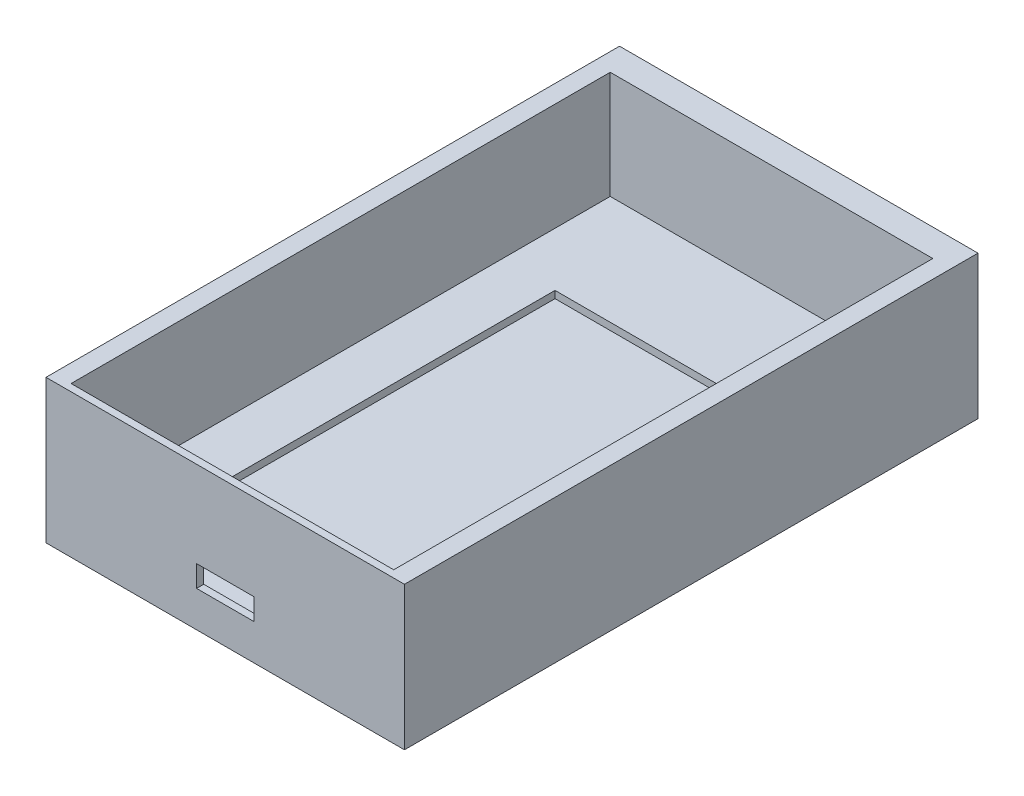
ISO-10303-21;
HEADER;
FILE_DESCRIPTION(('STEP AP214'),'2;1');
FILE_NAME('part.step','',(''),(''),'','','');
FILE_SCHEMA(('AUTOMOTIVE_DESIGN { 1 0 10303 214 1 1 1 1 }'));
ENDSEC;
DATA;
#1=APPLICATION_CONTEXT('core data for automotive mechanical design processes');
#2=APPLICATION_PROTOCOL_DEFINITION('international standard','automotive_design',2000,#1);
#3=PRODUCT_CONTEXT('',#1,'mechanical');
#4=PRODUCT('Part','Part','',(#3));
#5=PRODUCT_RELATED_PRODUCT_CATEGORY('part','',(#4));
#6=PRODUCT_DEFINITION_FORMATION('','',#4);
#7=PRODUCT_DEFINITION_CONTEXT('part definition',#1,'design');
#8=PRODUCT_DEFINITION('design','',#6,#7);
#9=PRODUCT_DEFINITION_SHAPE('','',#8);
#10=(LENGTH_UNIT() NAMED_UNIT(*) SI_UNIT(.MILLI.,.METRE.));
#11=(NAMED_UNIT(*) PLANE_ANGLE_UNIT() SI_UNIT($,.RADIAN.));
#12=(NAMED_UNIT(*) SI_UNIT($,.STERADIAN.) SOLID_ANGLE_UNIT());
#13=UNCERTAINTY_MEASURE_WITH_UNIT(LENGTH_MEASURE(1.E-05),#10,'distance_accuracy_value','');
#14=(GEOMETRIC_REPRESENTATION_CONTEXT(3) GLOBAL_UNCERTAINTY_ASSIGNED_CONTEXT((#13)) GLOBAL_UNIT_ASSIGNED_CONTEXT((#10,
#11,#12)) REPRESENTATION_CONTEXT('',''));
#15=CARTESIAN_POINT('',(0.,0.,0.));
#16=DIRECTION('',(0.,0.,1.));
#17=DIRECTION('',(1.,0.,0.));
#18=AXIS2_PLACEMENT_3D('',#15,#16,#17);
#19=CARTESIAN_POINT('',(0.,-5.,0.));
#20=DIRECTION('',(0.,1.,0.));
#21=DIRECTION('',(-1.,0.,0.));
#22=AXIS2_PLACEMENT_3D('',#19,#20,#21);
#23=PLANE('',#22);
#24=DIRECTION('',(0.,0.,1.));
#25=VECTOR('',#24,1.);
#26=CARTESIAN_POINT('',(-15.,-5.,39.));
#27=LINE('',#26,#25);
#28=CARTESIAN_POINT('',(-15.,-5.,-21.));
#29=VERTEX_POINT('',#28);
#30=CARTESIAN_POINT('',(-15.,-5.,39.));
#31=VERTEX_POINT('',#30);
#32=EDGE_CURVE('E151',#29,#31,#27,.T.);
#33=ORIENTED_EDGE('',*,*,#32,.F.);
#34=DIRECTION('',(-1.,0.,0.));
#35=VECTOR('',#34,1.);
#36=CARTESIAN_POINT('',(15.,-5.,-21.));
#37=LINE('',#36,#35);
#38=CARTESIAN_POINT('',(15.,-5.,-21.));
#39=VERTEX_POINT('',#38);
#40=EDGE_CURVE('E169',#39,#29,#37,.T.);
#41=ORIENTED_EDGE('',*,*,#40,.F.);
#42=DIRECTION('',(0.,0.,-1.));
#43=VECTOR('',#42,1.);
#44=CARTESIAN_POINT('',(15.,-5.,39.));
#45=LINE('',#44,#43);
#46=CARTESIAN_POINT('',(15.,-5.,39.));
#47=VERTEX_POINT('',#46);
#48=EDGE_CURVE('E172',#47,#39,#45,.T.);
#49=ORIENTED_EDGE('',*,*,#48,.F.);
#50=DIRECTION('',(1.,0.,0.));
#51=VECTOR('',#50,1.);
#52=CARTESIAN_POINT('',(22.5,-5.,39.));
#53=LINE('',#52,#51);
#54=CARTESIAN_POINT('',(22.5,-5.,39.));
#55=VERTEX_POINT('',#54);
#56=EDGE_CURVE('E215',#47,#55,#53,.T.);
#57=ORIENTED_EDGE('',*,*,#56,.T.);
#58=DIRECTION('',(0.,0.,-1.));
#59=VECTOR('',#58,1.);
#60=CARTESIAN_POINT('',(22.5,-5.,39.));
#61=LINE('',#60,#59);
#62=CARTESIAN_POINT('',(22.5,-5.,-36.2));
#63=VERTEX_POINT('',#62);
#64=EDGE_CURVE('E219',#55,#63,#61,.T.);
#65=ORIENTED_EDGE('',*,*,#64,.T.);
#66=DIRECTION('',(-1.,0.,0.));
#67=VECTOR('',#66,1.);
#68=CARTESIAN_POINT('',(22.5,-5.,-36.2));
#69=LINE('',#68,#67);
#70=CARTESIAN_POINT('',(-22.5,-5.,-36.2));
#71=VERTEX_POINT('',#70);
#72=EDGE_CURVE('E222',#63,#71,#69,.T.);
#73=ORIENTED_EDGE('',*,*,#72,.T.);
#74=DIRECTION('',(0.,0.,1.));
#75=VECTOR('',#74,1.);
#76=CARTESIAN_POINT('',(-22.5,-5.,39.));
#77=LINE('',#76,#75);
#78=CARTESIAN_POINT('',(-22.5,-5.,39.));
#79=VERTEX_POINT('',#78);
#80=EDGE_CURVE('E212',#71,#79,#77,.T.);
#81=ORIENTED_EDGE('',*,*,#80,.T.);
#82=EDGE_CURVE('E217',#79,#31,#53,.T.);
#83=ORIENTED_EDGE('',*,*,#82,.T.);
#84=EDGE_LOOP('',(#33,#41,#49,#57,#65,#73,#81,#83));
#85=FACE_BOUND('',#84,.T.);
#86=ADVANCED_FACE('F32',(#85),#23,.T.);
#87=CARTESIAN_POINT('',(-25.,-10.,40.));
#88=DIRECTION('',(1.,0.,0.));
#89=DIRECTION('',(0.,0.,-1.));
#90=AXIS2_PLACEMENT_3D('',#87,#88,#89);
#91=PLANE('',#90);
#92=DIRECTION('',(0.,-1.,0.));
#93=VECTOR('',#92,1.);
#94=CARTESIAN_POINT('',(-25.,-10.,-40.));
#95=LINE('',#94,#93);
#96=CARTESIAN_POINT('',(-25.,10.,-40.));
#97=VERTEX_POINT('',#96);
#98=CARTESIAN_POINT('',(-25.,-10.,-40.));
#99=VERTEX_POINT('',#98);
#100=EDGE_CURVE('E237',#97,#99,#95,.T.);
#101=ORIENTED_EDGE('',*,*,#100,.T.);
#102=DIRECTION('',(0.,0.,-1.));
#103=VECTOR('',#102,1.);
#104=CARTESIAN_POINT('',(-25.,-10.,40.));
#105=LINE('',#104,#103);
#106=CARTESIAN_POINT('',(-25.,-10.,40.));
#107=VERTEX_POINT('',#106);
#108=EDGE_CURVE('E40',#107,#99,#105,.T.);
#109=ORIENTED_EDGE('',*,*,#108,.F.);
#110=DIRECTION('',(0.,-1.,0.));
#111=VECTOR('',#110,1.);
#112=CARTESIAN_POINT('',(-25.,-10.,40.));
#113=LINE('',#112,#111);
#114=CARTESIAN_POINT('',(-25.,10.,40.));
#115=VERTEX_POINT('',#114);
#116=EDGE_CURVE('E244',#115,#107,#113,.T.);
#117=ORIENTED_EDGE('',*,*,#116,.F.);
#118=DIRECTION('',(0.,0.,-1.));
#119=VECTOR('',#118,1.);
#120=CARTESIAN_POINT('',(-25.,10.,40.));
#121=LINE('',#120,#119);
#122=EDGE_CURVE('E254',#115,#97,#121,.T.);
#123=ORIENTED_EDGE('',*,*,#122,.T.);
#124=EDGE_LOOP('',(#101,#109,#117,#123));
#125=FACE_BOUND('',#124,.T.);
#126=ADVANCED_FACE('F34',(#125),#91,.F.);
#127=CARTESIAN_POINT('',(25.,-10.,40.));
#128=DIRECTION('',(0.,1.,0.));
#129=DIRECTION('',(-1.,0.,0.));
#130=AXIS2_PLACEMENT_3D('',#127,#128,#129);
#131=PLANE('',#130);
#132=DIRECTION('',(1.,0.,0.));
#133=VECTOR('',#132,1.);
#134=CARTESIAN_POINT('',(25.,-10.,-40.));
#135=LINE('',#134,#133);
#136=CARTESIAN_POINT('',(25.,-10.,-40.));
#137=VERTEX_POINT('',#136);
#138=EDGE_CURVE('E257',#99,#137,#135,.T.);
#139=ORIENTED_EDGE('',*,*,#138,.T.);
#140=DIRECTION('',(0.,0.,-1.));
#141=VECTOR('',#140,1.);
#142=CARTESIAN_POINT('',(25.,-10.,40.));
#143=LINE('',#142,#141);
#144=CARTESIAN_POINT('',(25.,-10.,40.));
#145=VERTEX_POINT('',#144);
#146=EDGE_CURVE('E267',#145,#137,#143,.T.);
#147=ORIENTED_EDGE('',*,*,#146,.F.);
#148=DIRECTION('',(1.,0.,0.));
#149=VECTOR('',#148,1.);
#150=CARTESIAN_POINT('',(25.,-10.,40.));
#151=LINE('',#150,#149);
#152=EDGE_CURVE('E247',#107,#145,#151,.T.);
#153=ORIENTED_EDGE('',*,*,#152,.F.);
#154=ORIENTED_EDGE('',*,*,#108,.T.);
#155=EDGE_LOOP('',(#139,#147,#153,#154));
#156=FACE_BOUND('',#155,.T.);
#157=ADVANCED_FACE('F272',(#156),#131,.F.);
#158=CARTESIAN_POINT('',(25.,-10.,40.));
#159=DIRECTION('',(-1.,0.,0.));
#160=DIRECTION('',(0.,0.,1.));
#161=AXIS2_PLACEMENT_3D('',#158,#159,#160);
#162=PLANE('',#161);
#163=DIRECTION('',(0.,1.,0.));
#164=VECTOR('',#163,1.);
#165=CARTESIAN_POINT('',(25.,-10.,-40.));
#166=LINE('',#165,#164);
#167=CARTESIAN_POINT('',(25.,10.,-40.));
#168=VERTEX_POINT('',#167);
#169=EDGE_CURVE('E259',#137,#168,#166,.T.);
#170=ORIENTED_EDGE('',*,*,#169,.T.);
#171=DIRECTION('',(0.,0.,-1.));
#172=VECTOR('',#171,1.);
#173=CARTESIAN_POINT('',(25.,10.,40.));
#174=LINE('',#173,#172);
#175=CARTESIAN_POINT('',(25.,10.,40.));
#176=VERTEX_POINT('',#175);
#177=EDGE_CURVE('E264',#176,#168,#174,.T.);
#178=ORIENTED_EDGE('',*,*,#177,.F.);
#179=DIRECTION('',(0.,1.,0.));
#180=VECTOR('',#179,1.);
#181=CARTESIAN_POINT('',(25.,-10.,40.));
#182=LINE('',#181,#180);
#183=EDGE_CURVE('E250',#145,#176,#182,.T.);
#184=ORIENTED_EDGE('',*,*,#183,.F.);
#185=ORIENTED_EDGE('',*,*,#146,.T.);
#186=EDGE_LOOP('',(#170,#178,#184,#185));
#187=FACE_BOUND('',#186,.T.);
#188=ADVANCED_FACE('F284',(#187),#162,.F.);
#189=CARTESIAN_POINT('',(25.,10.,40.));
#190=DIRECTION('',(0.,-1.,0.));
#191=DIRECTION('',(1.,0.,0.));
#192=AXIS2_PLACEMENT_3D('',#189,#190,#191);
#193=PLANE('',#192);
#194=DIRECTION('',(1.,0.,0.));
#195=VECTOR('',#194,1.);
#196=CARTESIAN_POINT('',(22.5,10.,39.));
#197=LINE('',#196,#195);
#198=CARTESIAN_POINT('',(-22.5,10.,39.));
#199=VERTEX_POINT('',#198);
#200=CARTESIAN_POINT('',(22.5,10.,39.));
#201=VERTEX_POINT('',#200);
#202=EDGE_CURVE('E227',#199,#201,#197,.T.);
#203=ORIENTED_EDGE('',*,*,#202,.F.);
#204=DIRECTION('',(0.,0.,1.));
#205=VECTOR('',#204,1.);
#206=CARTESIAN_POINT('',(-22.5,10.,39.));
#207=LINE('',#206,#205);
#208=CARTESIAN_POINT('',(-22.5,10.,-36.2));
#209=VERTEX_POINT('',#208);
#210=EDGE_CURVE('E211',#209,#199,#207,.T.);
#211=ORIENTED_EDGE('',*,*,#210,.F.);
#212=DIRECTION('',(-1.,0.,0.));
#213=VECTOR('',#212,1.);
#214=CARTESIAN_POINT('',(22.5,10.,-36.2));
#215=LINE('',#214,#213);
#216=CARTESIAN_POINT('',(22.5,10.,-36.2));
#217=VERTEX_POINT('',#216);
#218=EDGE_CURVE('E216',#217,#209,#215,.T.);
#219=ORIENTED_EDGE('',*,*,#218,.F.);
#220=DIRECTION('',(0.,0.,-1.));
#221=VECTOR('',#220,1.);
#222=CARTESIAN_POINT('',(22.5,10.,39.));
#223=LINE('',#222,#221);
#224=EDGE_CURVE('E230',#201,#217,#223,.T.);
#225=ORIENTED_EDGE('',*,*,#224,.F.);
#226=EDGE_LOOP('',(#203,#211,#219,#225));
#227=FACE_BOUND('',#226,.T.);
#228=DIRECTION('',(-1.,0.,0.));
#229=VECTOR('',#228,1.);
#230=CARTESIAN_POINT('',(25.,10.,-40.));
#231=LINE('',#230,#229);
#232=EDGE_CURVE('E248',#168,#97,#231,.T.);
#233=ORIENTED_EDGE('',*,*,#232,.T.);
#234=ORIENTED_EDGE('',*,*,#122,.F.);
#235=DIRECTION('',(-1.,0.,0.));
#236=VECTOR('',#235,1.);
#237=CARTESIAN_POINT('',(25.,10.,40.));
#238=LINE('',#237,#236);
#239=EDGE_CURVE('E252',#176,#115,#238,.T.);
#240=ORIENTED_EDGE('',*,*,#239,.F.);
#241=ORIENTED_EDGE('',*,*,#177,.T.);
#242=EDGE_LOOP('',(#233,#234,#240,#241));
#243=FACE_BOUND('',#242,.T.);
#244=ADVANCED_FACE('F288',(#227,#243),#193,.F.);
#245=CARTESIAN_POINT('',(0.,0.,40.));
#246=DIRECTION('',(0.,0.,1.));
#247=DIRECTION('',(1.,0.,0.));
#248=AXIS2_PLACEMENT_3D('',#245,#246,#247);
#249=PLANE('',#248);
#250=DIRECTION('',(1.,0.,0.));
#251=VECTOR('',#250,1.);
#252=CARTESIAN_POINT('',(4.,-5.,40.));
#253=LINE('',#252,#251);
#254=CARTESIAN_POINT('',(-4.,-5.,40.));
#255=VERTEX_POINT('',#254);
#256=CARTESIAN_POINT('',(4.,-5.,40.));
#257=VERTEX_POINT('',#256);
#258=EDGE_CURVE('E191',#255,#257,#253,.T.);
#259=ORIENTED_EDGE('',*,*,#258,.F.);
#260=DIRECTION('',(0.,-1.,0.));
#261=VECTOR('',#260,1.);
#262=CARTESIAN_POINT('',(-4.,-5.,40.));
#263=LINE('',#262,#261);
#264=CARTESIAN_POINT('',(-4.,-2.,40.));
#265=VERTEX_POINT('',#264);
#266=EDGE_CURVE('E194',#265,#255,#263,.T.);
#267=ORIENTED_EDGE('',*,*,#266,.F.);
#268=DIRECTION('',(-1.,0.,0.));
#269=VECTOR('',#268,1.);
#270=CARTESIAN_POINT('',(4.,-2.,40.));
#271=LINE('',#270,#269);
#272=CARTESIAN_POINT('',(4.,-2.,40.));
#273=VERTEX_POINT('',#272);
#274=EDGE_CURVE('E47',#273,#265,#271,.T.);
#275=ORIENTED_EDGE('',*,*,#274,.F.);
#276=DIRECTION('',(0.,1.,0.));
#277=VECTOR('',#276,1.);
#278=CARTESIAN_POINT('',(4.,-5.,40.));
#279=LINE('',#278,#277);
#280=EDGE_CURVE('E188',#257,#273,#279,.T.);
#281=ORIENTED_EDGE('',*,*,#280,.F.);
#282=EDGE_LOOP('',(#259,#267,#275,#281));
#283=FACE_BOUND('',#282,.T.);
#284=ORIENTED_EDGE('',*,*,#116,.T.);
#285=ORIENTED_EDGE('',*,*,#152,.T.);
#286=ORIENTED_EDGE('',*,*,#183,.T.);
#287=ORIENTED_EDGE('',*,*,#239,.T.);
#288=EDGE_LOOP('',(#284,#285,#286,#287));
#289=FACE_BOUND('',#288,.T.);
#290=ADVANCED_FACE('F290',(#283,#289),#249,.T.);
#291=CARTESIAN_POINT('',(0.,0.,-40.));
#292=DIRECTION('',(0.,0.,1.));
#293=DIRECTION('',(1.,0.,0.));
#294=AXIS2_PLACEMENT_3D('',#291,#292,#293);
#295=PLANE('',#294);
#296=ORIENTED_EDGE('',*,*,#100,.F.);
#297=ORIENTED_EDGE('',*,*,#232,.F.);
#298=ORIENTED_EDGE('',*,*,#169,.F.);
#299=ORIENTED_EDGE('',*,*,#138,.F.);
#300=EDGE_LOOP('',(#296,#297,#298,#299));
#301=FACE_BOUND('',#300,.T.);
#302=ADVANCED_FACE('F280',(#301),#295,.F.);
#303=CARTESIAN_POINT('',(-22.5,-5.,39.));
#304=DIRECTION('',(-1.,0.,0.));
#305=DIRECTION('',(0.,-1.,0.));
#306=AXIS2_PLACEMENT_3D('',#303,#304,#305);
#307=PLANE('',#306);
#308=ORIENTED_EDGE('',*,*,#210,.T.);
#309=DIRECTION('',(0.,1.,0.));
#310=VECTOR('',#309,1.);
#311=CARTESIAN_POINT('',(-22.5,-5.,39.));
#312=LINE('',#311,#310);
#313=EDGE_CURVE('E225',#79,#199,#312,.T.);
#314=ORIENTED_EDGE('',*,*,#313,.F.);
#315=ORIENTED_EDGE('',*,*,#80,.F.);
#316=DIRECTION('',(0.,1.,0.));
#317=VECTOR('',#316,1.);
#318=CARTESIAN_POINT('',(-22.5,-5.,-36.2));
#319=LINE('',#318,#317);
#320=EDGE_CURVE('E235',#71,#209,#319,.T.);
#321=ORIENTED_EDGE('',*,*,#320,.T.);
#322=EDGE_LOOP('',(#308,#314,#315,#321));
#323=FACE_BOUND('',#322,.T.);
#324=ADVANCED_FACE('F298',(#323),#307,.F.);
#325=CARTESIAN_POINT('',(22.5,-5.,-36.2));
#326=DIRECTION('',(0.,0.,-1.));
#327=DIRECTION('',(-1.,0.,0.));
#328=AXIS2_PLACEMENT_3D('',#325,#326,#327);
#329=PLANE('',#328);
#330=ORIENTED_EDGE('',*,*,#218,.T.);
#331=ORIENTED_EDGE('',*,*,#320,.F.);
#332=ORIENTED_EDGE('',*,*,#72,.F.);
#333=DIRECTION('',(0.,1.,0.));
#334=VECTOR('',#333,1.);
#335=CARTESIAN_POINT('',(22.5,-5.,-36.2));
#336=LINE('',#335,#334);
#337=EDGE_CURVE('E238',#63,#217,#336,.T.);
#338=ORIENTED_EDGE('',*,*,#337,.T.);
#339=EDGE_LOOP('',(#330,#331,#332,#338));
#340=FACE_BOUND('',#339,.T.);
#341=ADVANCED_FACE('F396',(#340),#329,.F.);
#342=CARTESIAN_POINT('',(22.5,-5.,39.));
#343=DIRECTION('',(1.,0.,0.));
#344=DIRECTION('',(0.,1.,0.));
#345=AXIS2_PLACEMENT_3D('',#342,#343,#344);
#346=PLANE('',#345);
#347=ORIENTED_EDGE('',*,*,#224,.T.);
#348=ORIENTED_EDGE('',*,*,#337,.F.);
#349=ORIENTED_EDGE('',*,*,#64,.F.);
#350=DIRECTION('',(0.,1.,0.));
#351=VECTOR('',#350,1.);
#352=CARTESIAN_POINT('',(22.5,-5.,39.));
#353=LINE('',#352,#351);
#354=EDGE_CURVE('E240',#55,#201,#353,.T.);
#355=ORIENTED_EDGE('',*,*,#354,.T.);
#356=EDGE_LOOP('',(#347,#348,#349,#355));
#357=FACE_BOUND('',#356,.T.);
#358=ADVANCED_FACE('F324',(#357),#346,.F.);
#359=CARTESIAN_POINT('',(22.5,-5.,39.));
#360=DIRECTION('',(0.,0.,1.));
#361=DIRECTION('',(1.,0.,0.));
#362=AXIS2_PLACEMENT_3D('',#359,#360,#361);
#363=PLANE('',#362);
#364=DIRECTION('',(0.,1.,0.));
#365=VECTOR('',#364,1.);
#366=CARTESIAN_POINT('',(-4.,-5.,39.));
#367=LINE('',#366,#365);
#368=CARTESIAN_POINT('',(-3.99999999999999,-5.,39.));
#369=VERTEX_POINT('',#368);
#370=CARTESIAN_POINT('',(-4.,-2.,39.));
#371=VERTEX_POINT('',#370);
#372=EDGE_CURVE('E182',#369,#371,#367,.T.);
#373=ORIENTED_EDGE('',*,*,#372,.F.);
#374=DIRECTION('',(1.,0.,0.));
#375=VECTOR('',#374,1.);
#376=CARTESIAN_POINT('',(0.,-5.,39.));
#377=LINE('',#376,#375);
#378=CARTESIAN_POINT('',(4.00000000000002,-5.,39.));
#379=VERTEX_POINT('',#378);
#380=EDGE_CURVE('E11',#369,#379,#377,.T.);
#381=ORIENTED_EDGE('',*,*,#380,.T.);
#382=DIRECTION('',(0.,-1.,0.));
#383=VECTOR('',#382,1.);
#384=CARTESIAN_POINT('',(4.,-5.,39.));
#385=LINE('',#384,#383);
#386=CARTESIAN_POINT('',(4.,-2.,39.));
#387=VERTEX_POINT('',#386);
#388=EDGE_CURVE('E197',#387,#379,#385,.T.);
#389=ORIENTED_EDGE('',*,*,#388,.F.);
#390=DIRECTION('',(1.,0.,0.));
#391=VECTOR('',#390,1.);
#392=CARTESIAN_POINT('',(4.00000000000001,-2.,39.));
#393=LINE('',#392,#391);
#394=EDGE_CURVE('E200',#371,#387,#393,.T.);
#395=ORIENTED_EDGE('',*,*,#394,.F.);
#396=EDGE_LOOP('',(#373,#381,#389,#395));
#397=FACE_BOUND('',#396,.T.);
#398=ORIENTED_EDGE('',*,*,#56,.F.);
#399=DIRECTION('',(0.,1.,0.));
#400=VECTOR('',#399,1.);
#401=CARTESIAN_POINT('',(15.,-6.,39.));
#402=LINE('',#401,#400);
#403=CARTESIAN_POINT('',(15.,-6.,39.));
#404=VERTEX_POINT('',#403);
#405=EDGE_CURVE('E155',#404,#47,#402,.T.);
#406=ORIENTED_EDGE('',*,*,#405,.F.);
#407=DIRECTION('',(1.,0.,0.));
#408=VECTOR('',#407,1.);
#409=CARTESIAN_POINT('',(15.,-6.,39.));
#410=LINE('',#409,#408);
#411=CARTESIAN_POINT('',(-15.,-6.,39.));
#412=VERTEX_POINT('',#411);
#413=EDGE_CURVE('E159',#412,#404,#410,.T.);
#414=ORIENTED_EDGE('',*,*,#413,.F.);
#415=DIRECTION('',(0.,1.,0.));
#416=VECTOR('',#415,1.);
#417=CARTESIAN_POINT('',(-15.,-6.,39.));
#418=LINE('',#417,#416);
#419=EDGE_CURVE('E144',#412,#31,#418,.T.);
#420=ORIENTED_EDGE('',*,*,#419,.T.);
#421=ORIENTED_EDGE('',*,*,#82,.F.);
#422=ORIENTED_EDGE('',*,*,#313,.T.);
#423=ORIENTED_EDGE('',*,*,#202,.T.);
#424=ORIENTED_EDGE('',*,*,#354,.F.);
#425=EDGE_LOOP('',(#398,#406,#414,#420,#421,#422,#423,#424));
#426=FACE_BOUND('',#425,.T.);
#427=ADVANCED_FACE('F161',(#397,#426),#363,.F.);
#428=ORIENTED_EDGE('',*,*,#380,.F.);
#429=DIRECTION('',(0.,0.,1.));
#430=VECTOR('',#429,1.);
#431=CARTESIAN_POINT('',(-4.,-5.,-40.001));
#432=LINE('',#431,#430);
#433=EDGE_CURVE('E206',#369,#255,#432,.T.);
#434=ORIENTED_EDGE('',*,*,#433,.T.);
#435=ORIENTED_EDGE('',*,*,#258,.T.);
#436=DIRECTION('',(0.,0.,1.));
#437=VECTOR('',#436,1.);
#438=CARTESIAN_POINT('',(4.,-5.,-40.001));
#439=LINE('',#438,#437);
#440=EDGE_CURVE('E187',#379,#257,#439,.T.);
#441=ORIENTED_EDGE('',*,*,#440,.F.);
#442=EDGE_LOOP('',(#428,#434,#435,#441));
#443=FACE_BOUND('',#442,.T.);
#444=ADVANCED_FACE('F307',(#443),#23,.T.);
#445=CARTESIAN_POINT('',(4.,-5.,-40.001));
#446=DIRECTION('',(1.,0.,0.));
#447=DIRECTION('',(0.,0.,-1.));
#448=AXIS2_PLACEMENT_3D('',#445,#446,#447);
#449=PLANE('',#448);
#450=ORIENTED_EDGE('',*,*,#388,.T.);
#451=ORIENTED_EDGE('',*,*,#440,.T.);
#452=ORIENTED_EDGE('',*,*,#280,.T.);
#453=DIRECTION('',(0.,0.,1.));
#454=VECTOR('',#453,1.);
#455=CARTESIAN_POINT('',(4.,-2.,-40.001));
#456=LINE('',#455,#454);
#457=EDGE_CURVE('E207',#387,#273,#456,.T.);
#458=ORIENTED_EDGE('',*,*,#457,.F.);
#459=EDGE_LOOP('',(#450,#451,#452,#458));
#460=FACE_BOUND('',#459,.T.);
#461=ADVANCED_FACE('F316',(#460),#449,.F.);
#462=CARTESIAN_POINT('',(4.,-2.,-40.001));
#463=DIRECTION('',(0.,1.,0.));
#464=DIRECTION('',(-1.,0.,0.));
#465=AXIS2_PLACEMENT_3D('',#462,#463,#464);
#466=PLANE('',#465);
#467=ORIENTED_EDGE('',*,*,#394,.T.);
#468=ORIENTED_EDGE('',*,*,#457,.T.);
#469=ORIENTED_EDGE('',*,*,#274,.T.);
#470=DIRECTION('',(0.,0.,1.));
#471=VECTOR('',#470,1.);
#472=CARTESIAN_POINT('',(-4.,-2.,-40.001));
#473=LINE('',#472,#471);
#474=EDGE_CURVE('E204',#371,#265,#473,.T.);
#475=ORIENTED_EDGE('',*,*,#474,.F.);
#476=EDGE_LOOP('',(#467,#468,#469,#475));
#477=FACE_BOUND('',#476,.T.);
#478=ADVANCED_FACE('F321',(#477),#466,.F.);
#479=CARTESIAN_POINT('',(-4.,-5.,-40.001));
#480=DIRECTION('',(-1.,0.,0.));
#481=DIRECTION('',(0.,-1.,0.));
#482=AXIS2_PLACEMENT_3D('',#479,#480,#481);
#483=PLANE('',#482);
#484=ORIENTED_EDGE('',*,*,#372,.T.);
#485=ORIENTED_EDGE('',*,*,#474,.T.);
#486=ORIENTED_EDGE('',*,*,#266,.T.);
#487=ORIENTED_EDGE('',*,*,#433,.F.);
#488=EDGE_LOOP('',(#484,#485,#486,#487));
#489=FACE_BOUND('',#488,.T.);
#490=ADVANCED_FACE('F329',(#489),#483,.F.);
#491=CARTESIAN_POINT('',(-15.,-6.,39.));
#492=DIRECTION('',(-1.,0.,0.));
#493=DIRECTION('',(0.,-1.,0.));
#494=AXIS2_PLACEMENT_3D('',#491,#492,#493);
#495=PLANE('',#494);
#496=ORIENTED_EDGE('',*,*,#32,.T.);
#497=ORIENTED_EDGE('',*,*,#419,.F.);
#498=DIRECTION('',(0.,0.,1.));
#499=VECTOR('',#498,1.);
#500=CARTESIAN_POINT('',(-15.,-6.,39.));
#501=LINE('',#500,#499);
#502=CARTESIAN_POINT('',(-15.,-6.,-21.));
#503=VERTEX_POINT('',#502);
#504=EDGE_CURVE('E148',#503,#412,#501,.T.);
#505=ORIENTED_EDGE('',*,*,#504,.F.);
#506=DIRECTION('',(0.,1.,0.));
#507=VECTOR('',#506,1.);
#508=CARTESIAN_POINT('',(-15.,-6.,-21.));
#509=LINE('',#508,#507);
#510=EDGE_CURVE('E180',#503,#29,#509,.T.);
#511=ORIENTED_EDGE('',*,*,#510,.T.);
#512=EDGE_LOOP('',(#496,#497,#505,#511));
#513=FACE_BOUND('',#512,.T.);
#514=ADVANCED_FACE('F146',(#513),#495,.F.);
#515=CARTESIAN_POINT('',(15.,-6.,-21.));
#516=DIRECTION('',(0.,0.,-1.));
#517=DIRECTION('',(-1.,0.,0.));
#518=AXIS2_PLACEMENT_3D('',#515,#516,#517);
#519=PLANE('',#518);
#520=ORIENTED_EDGE('',*,*,#40,.T.);
#521=ORIENTED_EDGE('',*,*,#510,.F.);
#522=DIRECTION('',(-1.,0.,0.));
#523=VECTOR('',#522,1.);
#524=CARTESIAN_POINT('',(15.,-6.,-21.));
#525=LINE('',#524,#523);
#526=CARTESIAN_POINT('',(15.,-6.,-21.));
#527=VERTEX_POINT('',#526);
#528=EDGE_CURVE('E156',#527,#503,#525,.T.);
#529=ORIENTED_EDGE('',*,*,#528,.F.);
#530=DIRECTION('',(0.,1.,0.));
#531=VECTOR('',#530,1.);
#532=CARTESIAN_POINT('',(15.,-6.,-21.));
#533=LINE('',#532,#531);
#534=EDGE_CURVE('E183',#527,#39,#533,.T.);
#535=ORIENTED_EDGE('',*,*,#534,.T.);
#536=EDGE_LOOP('',(#520,#521,#529,#535));
#537=FACE_BOUND('',#536,.T.);
#538=ADVANCED_FACE('F343',(#537),#519,.F.);
#539=CARTESIAN_POINT('',(15.,-6.,39.));
#540=DIRECTION('',(1.,0.,0.));
#541=DIRECTION('',(0.,1.,0.));
#542=AXIS2_PLACEMENT_3D('',#539,#540,#541);
#543=PLANE('',#542);
#544=ORIENTED_EDGE('',*,*,#48,.T.);
#545=ORIENTED_EDGE('',*,*,#534,.F.);
#546=DIRECTION('',(0.,0.,-1.));
#547=VECTOR('',#546,1.);
#548=CARTESIAN_POINT('',(15.,-6.,39.));
#549=LINE('',#548,#547);
#550=EDGE_CURVE('E165',#404,#527,#549,.T.);
#551=ORIENTED_EDGE('',*,*,#550,.F.);
#552=ORIENTED_EDGE('',*,*,#405,.T.);
#553=EDGE_LOOP('',(#544,#545,#551,#552));
#554=FACE_BOUND('',#553,.T.);
#555=ADVANCED_FACE('F344',(#554),#543,.F.);
#556=CARTESIAN_POINT('',(0.,-6.,0.));
#557=DIRECTION('',(0.,1.,0.));
#558=DIRECTION('',(-1.,0.,0.));
#559=AXIS2_PLACEMENT_3D('',#556,#557,#558);
#560=PLANE('',#559);
#561=ORIENTED_EDGE('',*,*,#504,.T.);
#562=ORIENTED_EDGE('',*,*,#413,.T.);
#563=ORIENTED_EDGE('',*,*,#550,.T.);
#564=ORIENTED_EDGE('',*,*,#528,.T.);
#565=EDGE_LOOP('',(#561,#562,#563,#564));
#566=FACE_BOUND('',#565,.T.);
#567=ADVANCED_FACE('F167',(#566),#560,.T.);
#568=CLOSED_SHELL('',(#86,#126,#157,#188,#244,#290,#302,#324,#341,#358,#427,#444,#461,#478,#490,
#514,#538,#555,#567));
#569=MANIFOLD_SOLID_BREP('B2',#568);
#570=ADVANCED_BREP_SHAPE_REPRESENTATION('',(#18,#569),#14);
#571=SHAPE_DEFINITION_REPRESENTATION(#9,#570);
ENDSEC;
END-ISO-10303-21;
